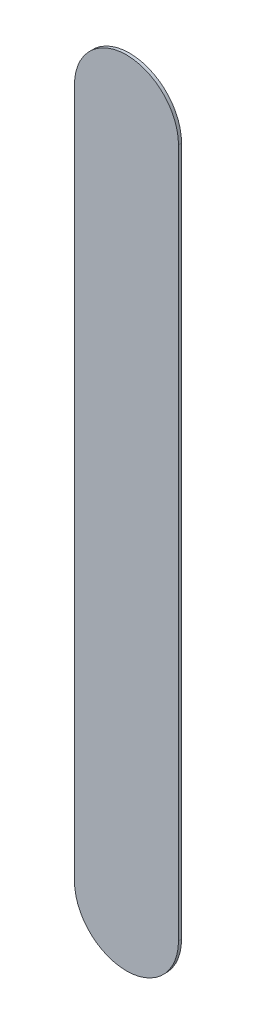
ISO-10303-21;
HEADER;
FILE_DESCRIPTION(('STEP AP214'),'2;1');
FILE_NAME('part.step','',(''),(''),'','','');
FILE_SCHEMA(('AUTOMOTIVE_DESIGN { 1 0 10303 214 1 1 1 1 }'));
ENDSEC;
DATA;
#1=APPLICATION_CONTEXT('core data for automotive mechanical design processes');
#2=APPLICATION_PROTOCOL_DEFINITION('international standard','automotive_design',2000,#1);
#3=PRODUCT_CONTEXT('',#1,'mechanical');
#4=PRODUCT('Part','Part','',(#3));
#5=PRODUCT_RELATED_PRODUCT_CATEGORY('part','',(#4));
#6=PRODUCT_DEFINITION_FORMATION('','',#4);
#7=PRODUCT_DEFINITION_CONTEXT('part definition',#1,'design');
#8=PRODUCT_DEFINITION('design','',#6,#7);
#9=PRODUCT_DEFINITION_SHAPE('','',#8);
#10=(LENGTH_UNIT() NAMED_UNIT(*) SI_UNIT(.MILLI.,.METRE.));
#11=(NAMED_UNIT(*) PLANE_ANGLE_UNIT() SI_UNIT($,.RADIAN.));
#12=(NAMED_UNIT(*) SI_UNIT($,.STERADIAN.) SOLID_ANGLE_UNIT());
#13=UNCERTAINTY_MEASURE_WITH_UNIT(LENGTH_MEASURE(1.E-05),#10,'distance_accuracy_value','');
#14=(GEOMETRIC_REPRESENTATION_CONTEXT(3) GLOBAL_UNCERTAINTY_ASSIGNED_CONTEXT((#13)) GLOBAL_UNIT_ASSIGNED_CONTEXT((#10,
#11,#12)) REPRESENTATION_CONTEXT('',''));
#15=CARTESIAN_POINT('',(0.,0.,0.));
#16=DIRECTION('',(0.,0.,1.));
#17=DIRECTION('',(1.,0.,0.));
#18=AXIS2_PLACEMENT_3D('',#15,#16,#17);
#19=CARTESIAN_POINT('',(99.99999812,59.93251412,0.));
#20=DIRECTION('',(-1.,0.,0.));
#21=DIRECTION('',(0.,1.,0.));
#22=AXIS2_PLACEMENT_3D('',#19,#20,#21);
#23=PLANE('',#22);
#24=DIRECTION('',(0.,1.,0.));
#25=VECTOR('',#24,1.);
#26=CARTESIAN_POINT('',(99.99999812,59.93251412,0.03556));
#27=LINE('',#26,#25);
#28=CARTESIAN_POINT('',(99.99999812,59.93251412,0.03556));
#29=VERTEX_POINT('',#28);
#30=CARTESIAN_POINT('',(99.99999812,67.88419494,0.03556));
#31=VERTEX_POINT('',#30);
#32=EDGE_CURVE('E11',#29,#31,#27,.T.);
#33=ORIENTED_EDGE('',*,*,#32,.F.);
#34=DIRECTION('',(0.,0.,1.));
#35=VECTOR('',#34,1.);
#36=CARTESIAN_POINT('',(99.99999812,59.93251412,0.));
#37=LINE('',#36,#35);
#38=CARTESIAN_POINT('',(99.99999812,59.93251412,0.));
#39=VERTEX_POINT('',#38);
#40=EDGE_CURVE('E24',#39,#29,#37,.T.);
#41=ORIENTED_EDGE('',*,*,#40,.F.);
#42=DIRECTION('',(0.,1.,0.));
#43=VECTOR('',#42,1.);
#44=CARTESIAN_POINT('',(99.99999812,59.93251412,0.));
#45=LINE('',#44,#43);
#46=CARTESIAN_POINT('',(99.99999812,67.88419494,0.));
#47=VERTEX_POINT('',#46);
#48=EDGE_CURVE('E75',#39,#47,#45,.T.);
#49=ORIENTED_EDGE('',*,*,#48,.T.);
#50=DIRECTION('',(0.,0.,1.));
#51=VECTOR('',#50,1.);
#52=CARTESIAN_POINT('',(99.99999812,67.88419494,0.));
#53=LINE('',#52,#51);
#54=EDGE_CURVE('E37',#47,#31,#53,.T.);
#55=ORIENTED_EDGE('',*,*,#54,.T.);
#56=EDGE_LOOP('',(#33,#41,#49,#55));
#57=FACE_BOUND('',#56,.T.);
#58=ADVANCED_FACE('F17',(#57),#23,.F.);
#59=CARTESIAN_POINT('',(99.39999932,67.88419494,0.));
#60=DIRECTION('',(0.,0.,-1.));
#61=DIRECTION('',(1.,0.,0.));
#62=AXIS2_PLACEMENT_3D('',#59,#60,#61);
#63=CYLINDRICAL_SURFACE('',#62,0.599998799999999);
#64=CARTESIAN_POINT('',(99.39999932,67.88419494,0.03556));
#65=DIRECTION('',(0.,0.,1.));
#66=DIRECTION('',(1.,0.,0.));
#67=AXIS2_PLACEMENT_3D('',#64,#65,#66);
#68=CIRCLE('',#67,0.599998799999999);
#69=CARTESIAN_POINT('',(98.80000052,67.88419494,0.03556));
#70=VERTEX_POINT('',#69);
#71=EDGE_CURVE('E83',#31,#70,#68,.T.);
#72=ORIENTED_EDGE('',*,*,#71,.F.);
#73=ORIENTED_EDGE('',*,*,#54,.F.);
#74=CARTESIAN_POINT('',(99.39999932,67.88419494,0.));
#75=DIRECTION('',(0.,0.,1.));
#76=DIRECTION('',(1.,0.,0.));
#77=AXIS2_PLACEMENT_3D('',#74,#75,#76);
#78=CIRCLE('',#77,0.599998799999999);
#79=CARTESIAN_POINT('',(98.80000052,67.88419494,0.));
#80=VERTEX_POINT('',#79);
#81=EDGE_CURVE('E81',#47,#80,#78,.T.);
#82=ORIENTED_EDGE('',*,*,#81,.T.);
#83=DIRECTION('',(0.,0.,1.));
#84=VECTOR('',#83,1.);
#85=CARTESIAN_POINT('',(98.80000052,67.88419494,0.));
#86=LINE('',#85,#84);
#87=EDGE_CURVE('E67',#80,#70,#86,.T.);
#88=ORIENTED_EDGE('',*,*,#87,.T.);
#89=EDGE_LOOP('',(#72,#73,#82,#88));
#90=FACE_BOUND('',#89,.T.);
#91=ADVANCED_FACE('F89',(#90),#63,.T.);
#92=CARTESIAN_POINT('',(98.80000052,67.88419494,0.));
#93=DIRECTION('',(1.,0.,0.));
#94=DIRECTION('',(0.,-1.,0.));
#95=AXIS2_PLACEMENT_3D('',#92,#93,#94);
#96=PLANE('',#95);
#97=DIRECTION('',(0.,-1.,0.));
#98=VECTOR('',#97,1.);
#99=CARTESIAN_POINT('',(98.80000052,67.88419494,0.03556));
#100=LINE('',#99,#98);
#101=CARTESIAN_POINT('',(98.80000052,59.93251412,0.03556));
#102=VERTEX_POINT('',#101);
#103=EDGE_CURVE('E71',#70,#102,#100,.T.);
#104=ORIENTED_EDGE('',*,*,#103,.F.);
#105=ORIENTED_EDGE('',*,*,#87,.F.);
#106=DIRECTION('',(0.,-1.,0.));
#107=VECTOR('',#106,1.);
#108=CARTESIAN_POINT('',(98.80000052,67.88419494,0.));
#109=LINE('',#108,#107);
#110=CARTESIAN_POINT('',(98.80000052,59.93251412,0.));
#111=VERTEX_POINT('',#110);
#112=EDGE_CURVE('E63',#80,#111,#109,.T.);
#113=ORIENTED_EDGE('',*,*,#112,.T.);
#114=DIRECTION('',(0.,0.,1.));
#115=VECTOR('',#114,1.);
#116=CARTESIAN_POINT('',(98.80000052,59.93251412,0.));
#117=LINE('',#116,#115);
#118=EDGE_CURVE('E53',#111,#102,#117,.T.);
#119=ORIENTED_EDGE('',*,*,#118,.T.);
#120=EDGE_LOOP('',(#104,#105,#113,#119));
#121=FACE_BOUND('',#120,.T.);
#122=ADVANCED_FACE('F66',(#121),#96,.F.);
#123=CARTESIAN_POINT('',(99.39999932,59.93251412,0.));
#124=DIRECTION('',(0.,0.,-1.));
#125=DIRECTION('',(-1.,0.,0.));
#126=AXIS2_PLACEMENT_3D('',#123,#124,#125);
#127=CYLINDRICAL_SURFACE('',#126,0.599998799999997);
#128=CARTESIAN_POINT('',(99.39999932,59.93251412,0.03556));
#129=DIRECTION('',(0.,0.,1.));
#130=DIRECTION('',(-1.,0.,0.));
#131=AXIS2_PLACEMENT_3D('',#128,#129,#130);
#132=CIRCLE('',#131,0.599998799999997);
#133=EDGE_CURVE('E59',#102,#29,#132,.T.);
#134=ORIENTED_EDGE('',*,*,#133,.F.);
#135=ORIENTED_EDGE('',*,*,#118,.F.);
#136=CARTESIAN_POINT('',(99.39999932,59.93251412,0.));
#137=DIRECTION('',(0.,0.,1.));
#138=DIRECTION('',(-1.,0.,0.));
#139=AXIS2_PLACEMENT_3D('',#136,#137,#138);
#140=CIRCLE('',#139,0.599998799999997);
#141=EDGE_CURVE('E57',#111,#39,#140,.T.);
#142=ORIENTED_EDGE('',*,*,#141,.T.);
#143=ORIENTED_EDGE('',*,*,#40,.T.);
#144=EDGE_LOOP('',(#134,#135,#142,#143));
#145=FACE_BOUND('',#144,.T.);
#146=ADVANCED_FACE('F55',(#145),#127,.T.);
#147=CARTESIAN_POINT('',(99.99999812,59.93251412,0.));
#148=DIRECTION('',(0.,0.,-1.));
#149=DIRECTION('',(-1.,0.,0.));
#150=AXIS2_PLACEMENT_3D('',#147,#148,#149);
#151=PLANE('',#150);
#152=ORIENTED_EDGE('',*,*,#141,.F.);
#153=ORIENTED_EDGE('',*,*,#112,.F.);
#154=ORIENTED_EDGE('',*,*,#81,.F.);
#155=ORIENTED_EDGE('',*,*,#48,.F.);
#156=EDGE_LOOP('',(#152,#153,#154,#155));
#157=FACE_BOUND('',#156,.T.);
#158=ADVANCED_FACE('F74',(#157),#151,.T.);
#159=CARTESIAN_POINT('',(99.99999812,59.93251412,0.03556));
#160=DIRECTION('',(0.,0.,-1.));
#161=DIRECTION('',(-1.,0.,0.));
#162=AXIS2_PLACEMENT_3D('',#159,#160,#161);
#163=PLANE('',#162);
#164=ORIENTED_EDGE('',*,*,#32,.T.);
#165=ORIENTED_EDGE('',*,*,#71,.T.);
#166=ORIENTED_EDGE('',*,*,#103,.T.);
#167=ORIENTED_EDGE('',*,*,#133,.T.);
#168=EDGE_LOOP('',(#164,#165,#166,#167));
#169=FACE_BOUND('',#168,.T.);
#170=ADVANCED_FACE('F91',(#169),#163,.F.);
#171=CLOSED_SHELL('',(#58,#91,#122,#146,#158,#170));
#172=MANIFOLD_SOLID_BREP('B1',#171);
#173=ADVANCED_BREP_SHAPE_REPRESENTATION('',(#18,#172),#14);
#174=SHAPE_DEFINITION_REPRESENTATION(#9,#173);
ENDSEC;
END-ISO-10303-21;
